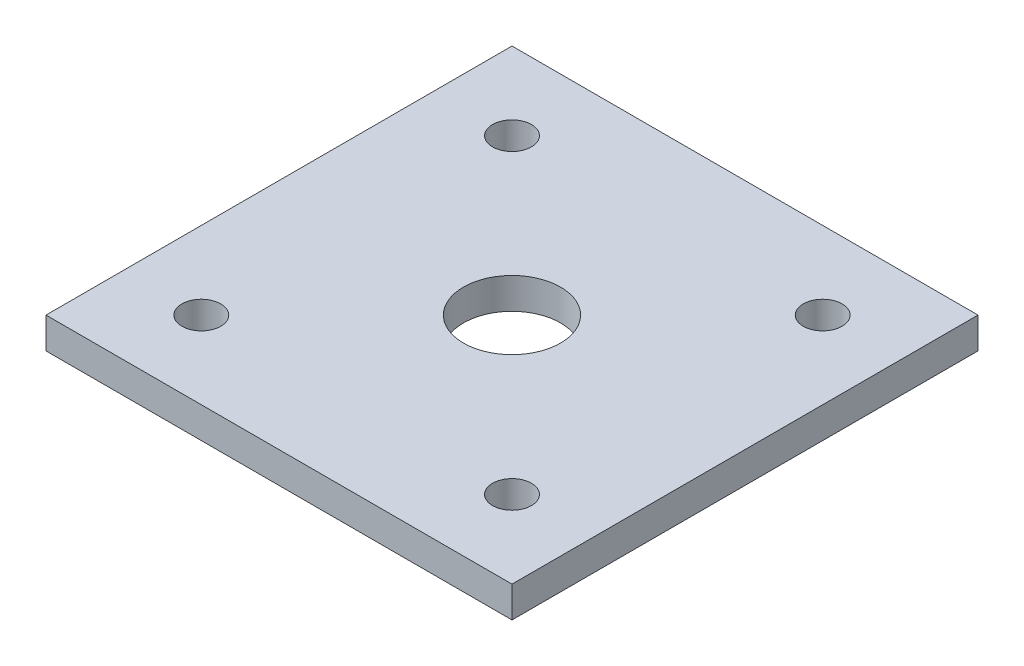
ISO-10303-21;
HEADER;
FILE_DESCRIPTION(('STEP AP214'),'2;1');
FILE_NAME('part.step','',(''),(''),'','','');
FILE_SCHEMA(('AUTOMOTIVE_DESIGN { 1 0 10303 214 1 1 1 1 }'));
ENDSEC;
DATA;
#1=APPLICATION_CONTEXT('core data for automotive mechanical design processes');
#2=APPLICATION_PROTOCOL_DEFINITION('international standard','automotive_design',2000,#1);
#3=PRODUCT_CONTEXT('',#1,'mechanical');
#4=PRODUCT('Part','Part','',(#3));
#5=PRODUCT_RELATED_PRODUCT_CATEGORY('part','',(#4));
#6=PRODUCT_DEFINITION_FORMATION('','',#4);
#7=PRODUCT_DEFINITION_CONTEXT('part definition',#1,'design');
#8=PRODUCT_DEFINITION('design','',#6,#7);
#9=PRODUCT_DEFINITION_SHAPE('','',#8);
#10=(LENGTH_UNIT() NAMED_UNIT(*) SI_UNIT(.MILLI.,.METRE.));
#11=(NAMED_UNIT(*) PLANE_ANGLE_UNIT() SI_UNIT($,.RADIAN.));
#12=(NAMED_UNIT(*) SI_UNIT($,.STERADIAN.) SOLID_ANGLE_UNIT());
#13=UNCERTAINTY_MEASURE_WITH_UNIT(LENGTH_MEASURE(1.E-05),#10,'distance_accuracy_value','');
#14=(GEOMETRIC_REPRESENTATION_CONTEXT(3) GLOBAL_UNCERTAINTY_ASSIGNED_CONTEXT((#13)) GLOBAL_UNIT_ASSIGNED_CONTEXT((#10,
#11,#12)) REPRESENTATION_CONTEXT('',''));
#15=CARTESIAN_POINT('',(0.,0.,0.));
#16=DIRECTION('',(0.,0.,1.));
#17=DIRECTION('',(1.,0.,0.));
#18=AXIS2_PLACEMENT_3D('',#15,#16,#17);
#19=CARTESIAN_POINT('',(60.,8.,-60.));
#20=DIRECTION('',(-1.,0.,0.));
#21=DIRECTION('',(0.,0.,1.));
#22=AXIS2_PLACEMENT_3D('',#19,#20,#21);
#23=PLANE('',#22);
#24=DIRECTION('',(0.,0.,-1.));
#25=VECTOR('',#24,1.);
#26=CARTESIAN_POINT('',(60.,0.,-60.));
#27=LINE('',#26,#25);
#28=CARTESIAN_POINT('',(60.,0.,60.));
#29=VERTEX_POINT('',#28);
#30=CARTESIAN_POINT('',(60.,0.,-60.));
#31=VERTEX_POINT('',#30);
#32=EDGE_CURVE('E95',#29,#31,#27,.T.);
#33=ORIENTED_EDGE('',*,*,#32,.T.);
#34=DIRECTION('',(0.,-1.,0.));
#35=VECTOR('',#34,1.);
#36=CARTESIAN_POINT('',(60.,8.,-60.));
#37=LINE('',#36,#35);
#38=CARTESIAN_POINT('',(60.,8.,-60.));
#39=VERTEX_POINT('',#38);
#40=EDGE_CURVE('E11',#39,#31,#37,.T.);
#41=ORIENTED_EDGE('',*,*,#40,.F.);
#42=DIRECTION('',(0.,0.,-1.));
#43=VECTOR('',#42,1.);
#44=CARTESIAN_POINT('',(60.,8.,-60.));
#45=LINE('',#44,#43);
#46=CARTESIAN_POINT('',(60.,8.,60.));
#47=VERTEX_POINT('',#46);
#48=EDGE_CURVE('E83',#47,#39,#45,.T.);
#49=ORIENTED_EDGE('',*,*,#48,.F.);
#50=DIRECTION('',(0.,-1.,0.));
#51=VECTOR('',#50,1.);
#52=CARTESIAN_POINT('',(60.,8.,60.));
#53=LINE('',#52,#51);
#54=EDGE_CURVE('E91',#47,#29,#53,.T.);
#55=ORIENTED_EDGE('',*,*,#54,.T.);
#56=EDGE_LOOP('',(#33,#41,#49,#55));
#57=FACE_BOUND('',#56,.T.);
#58=ADVANCED_FACE('F32',(#57),#23,.F.);
#59=CARTESIAN_POINT('',(-60.,8.,-60.));
#60=DIRECTION('',(0.,0.,1.));
#61=DIRECTION('',(1.,0.,0.));
#62=AXIS2_PLACEMENT_3D('',#59,#60,#61);
#63=PLANE('',#62);
#64=DIRECTION('',(-1.,0.,0.));
#65=VECTOR('',#64,1.);
#66=CARTESIAN_POINT('',(-60.,0.,-60.));
#67=LINE('',#66,#65);
#68=CARTESIAN_POINT('',(-60.,0.,-60.));
#69=VERTEX_POINT('',#68);
#70=EDGE_CURVE('E87',#31,#69,#67,.T.);
#71=ORIENTED_EDGE('',*,*,#70,.T.);
#72=DIRECTION('',(0.,-1.,0.));
#73=VECTOR('',#72,1.);
#74=CARTESIAN_POINT('',(-60.,8.,-60.));
#75=LINE('',#74,#73);
#76=CARTESIAN_POINT('',(-60.,8.,-60.));
#77=VERTEX_POINT('',#76);
#78=EDGE_CURVE('E40',#77,#69,#75,.T.);
#79=ORIENTED_EDGE('',*,*,#78,.F.);
#80=DIRECTION('',(-1.,0.,0.));
#81=VECTOR('',#80,1.);
#82=CARTESIAN_POINT('',(-60.,8.,-60.));
#83=LINE('',#82,#81);
#84=EDGE_CURVE('E78',#39,#77,#83,.T.);
#85=ORIENTED_EDGE('',*,*,#84,.F.);
#86=ORIENTED_EDGE('',*,*,#40,.T.);
#87=EDGE_LOOP('',(#71,#79,#85,#86));
#88=FACE_BOUND('',#87,.T.);
#89=ADVANCED_FACE('F86',(#88),#63,.F.);
#90=CARTESIAN_POINT('',(-60.,8.,-60.));
#91=DIRECTION('',(1.,0.,0.));
#92=DIRECTION('',(0.,0.,-1.));
#93=AXIS2_PLACEMENT_3D('',#90,#91,#92);
#94=PLANE('',#93);
#95=DIRECTION('',(0.,0.,1.));
#96=VECTOR('',#95,1.);
#97=CARTESIAN_POINT('',(-60.,0.,-60.));
#98=LINE('',#97,#96);
#99=CARTESIAN_POINT('',(-60.,0.,60.));
#100=VERTEX_POINT('',#99);
#101=EDGE_CURVE('E65',#69,#100,#98,.T.);
#102=ORIENTED_EDGE('',*,*,#101,.T.);
#103=DIRECTION('',(0.,-1.,0.));
#104=VECTOR('',#103,1.);
#105=CARTESIAN_POINT('',(-60.,8.,60.));
#106=LINE('',#105,#104);
#107=CARTESIAN_POINT('',(-60.,8.,60.));
#108=VERTEX_POINT('',#107);
#109=EDGE_CURVE('E88',#108,#100,#106,.T.);
#110=ORIENTED_EDGE('',*,*,#109,.F.);
#111=DIRECTION('',(0.,0.,1.));
#112=VECTOR('',#111,1.);
#113=CARTESIAN_POINT('',(-60.,8.,-60.));
#114=LINE('',#113,#112);
#115=EDGE_CURVE('E81',#77,#108,#114,.T.);
#116=ORIENTED_EDGE('',*,*,#115,.F.);
#117=ORIENTED_EDGE('',*,*,#78,.T.);
#118=EDGE_LOOP('',(#102,#110,#116,#117));
#119=FACE_BOUND('',#118,.T.);
#120=ADVANCED_FACE('F89',(#119),#94,.F.);
#121=CARTESIAN_POINT('',(-60.,8.,60.));
#122=DIRECTION('',(0.,0.,-1.));
#123=DIRECTION('',(-1.,0.,0.));
#124=AXIS2_PLACEMENT_3D('',#121,#122,#123);
#125=PLANE('',#124);
#126=DIRECTION('',(1.,0.,0.));
#127=VECTOR('',#126,1.);
#128=CARTESIAN_POINT('',(-60.,0.,60.));
#129=LINE('',#128,#127);
#130=EDGE_CURVE('E71',#100,#29,#129,.T.);
#131=ORIENTED_EDGE('',*,*,#130,.T.);
#132=ORIENTED_EDGE('',*,*,#54,.F.);
#133=DIRECTION('',(1.,0.,0.));
#134=VECTOR('',#133,1.);
#135=CARTESIAN_POINT('',(-60.,8.,60.));
#136=LINE('',#135,#134);
#137=EDGE_CURVE('E48',#108,#47,#136,.T.);
#138=ORIENTED_EDGE('',*,*,#137,.F.);
#139=ORIENTED_EDGE('',*,*,#109,.T.);
#140=EDGE_LOOP('',(#131,#132,#138,#139));
#141=FACE_BOUND('',#140,.T.);
#142=ADVANCED_FACE('F103',(#141),#125,.F.);
#143=CARTESIAN_POINT('',(0.,8.,0.));
#144=DIRECTION('',(0.,1.,0.));
#145=DIRECTION('',(0.,0.,1.));
#146=AXIS2_PLACEMENT_3D('',#143,#144,#145);
#147=PLANE('',#146);
#148=CARTESIAN_POINT('',(-40.,8.,40.));
#149=DIRECTION('',(0.,-1.,0.));
#150=DIRECTION('',(0.,0.,-1.));
#151=AXIS2_PLACEMENT_3D('',#148,#149,#150);
#152=CIRCLE('',#151,5.);
#153=CARTESIAN_POINT('',(-40.,8.,35.));
#154=VERTEX_POINT('',#153);
#155=EDGE_CURVE('E133',#154,#154,#152,.T.);
#156=ORIENTED_EDGE('',*,*,#155,.T.);
#157=EDGE_LOOP('',(#156));
#158=FACE_BOUND('',#157,.T.);
#159=CARTESIAN_POINT('',(40.,8.,40.));
#160=DIRECTION('',(0.,1.,0.));
#161=DIRECTION('',(0.,0.,-1.));
#162=AXIS2_PLACEMENT_3D('',#159,#160,#161);
#163=CIRCLE('',#162,5.);
#164=CARTESIAN_POINT('',(40.,8.,35.));
#165=VERTEX_POINT('',#164);
#166=EDGE_CURVE('E127',#165,#165,#163,.T.);
#167=ORIENTED_EDGE('',*,*,#166,.F.);
#168=EDGE_LOOP('',(#167));
#169=FACE_BOUND('',#168,.T.);
#170=CARTESIAN_POINT('',(40.,8.,-40.));
#171=DIRECTION('',(0.,-1.,0.));
#172=DIRECTION('',(0.,0.,1.));
#173=AXIS2_PLACEMENT_3D('',#170,#171,#172);
#174=CIRCLE('',#173,5.);
#175=CARTESIAN_POINT('',(40.,8.,-35.));
#176=VERTEX_POINT('',#175);
#177=EDGE_CURVE('E121',#176,#176,#174,.T.);
#178=ORIENTED_EDGE('',*,*,#177,.T.);
#179=EDGE_LOOP('',(#178));
#180=FACE_BOUND('',#179,.T.);
#181=CARTESIAN_POINT('',(-40.,8.,-40.));
#182=DIRECTION('',(0.,1.,0.));
#183=DIRECTION('',(0.,0.,1.));
#184=AXIS2_PLACEMENT_3D('',#181,#182,#183);
#185=CIRCLE('',#184,5.);
#186=CARTESIAN_POINT('',(-40.,8.,-35.));
#187=VERTEX_POINT('',#186);
#188=EDGE_CURVE('E115',#187,#187,#185,.T.);
#189=ORIENTED_EDGE('',*,*,#188,.F.);
#190=EDGE_LOOP('',(#189));
#191=FACE_BOUND('',#190,.T.);
#192=CARTESIAN_POINT('',(0.,8.,0.));
#193=DIRECTION('',(0.,1.,0.));
#194=DIRECTION('',(0.,0.,1.));
#195=AXIS2_PLACEMENT_3D('',#192,#193,#194);
#196=CIRCLE('',#195,12.5);
#197=CARTESIAN_POINT('',(0.,8.,12.5));
#198=VERTEX_POINT('',#197);
#199=EDGE_CURVE('E109',#198,#198,#196,.T.);
#200=ORIENTED_EDGE('',*,*,#199,.F.);
#201=EDGE_LOOP('',(#200));
#202=FACE_BOUND('',#201,.T.);
#203=ORIENTED_EDGE('',*,*,#48,.T.);
#204=ORIENTED_EDGE('',*,*,#84,.T.);
#205=ORIENTED_EDGE('',*,*,#115,.T.);
#206=ORIENTED_EDGE('',*,*,#137,.T.);
#207=EDGE_LOOP('',(#203,#204,#205,#206));
#208=FACE_BOUND('',#207,.T.);
#209=ADVANCED_FACE('F79',(#158,#169,#180,#191,#202,#208),#147,.T.);
#210=CARTESIAN_POINT('',(0.,0.,0.));
#211=DIRECTION('',(0.,1.,0.));
#212=DIRECTION('',(0.,0.,1.));
#213=AXIS2_PLACEMENT_3D('',#210,#211,#212);
#214=PLANE('',#213);
#215=CARTESIAN_POINT('',(-40.,0.,40.));
#216=DIRECTION('',(0.,-1.,0.));
#217=DIRECTION('',(0.,0.,-1.));
#218=AXIS2_PLACEMENT_3D('',#215,#216,#217);
#219=CIRCLE('',#218,5.);
#220=CARTESIAN_POINT('',(-40.,0.,35.));
#221=VERTEX_POINT('',#220);
#222=EDGE_CURVE('E130',#221,#221,#219,.T.);
#223=ORIENTED_EDGE('',*,*,#222,.F.);
#224=EDGE_LOOP('',(#223));
#225=FACE_BOUND('',#224,.T.);
#226=CARTESIAN_POINT('',(40.,0.,40.));
#227=DIRECTION('',(0.,1.,0.));
#228=DIRECTION('',(0.,0.,-1.));
#229=AXIS2_PLACEMENT_3D('',#226,#227,#228);
#230=CIRCLE('',#229,5.);
#231=CARTESIAN_POINT('',(40.,0.,35.));
#232=VERTEX_POINT('',#231);
#233=EDGE_CURVE('E124',#232,#232,#230,.T.);
#234=ORIENTED_EDGE('',*,*,#233,.T.);
#235=EDGE_LOOP('',(#234));
#236=FACE_BOUND('',#235,.T.);
#237=CARTESIAN_POINT('',(40.,0.,-40.));
#238=DIRECTION('',(0.,-1.,0.));
#239=DIRECTION('',(0.,0.,1.));
#240=AXIS2_PLACEMENT_3D('',#237,#238,#239);
#241=CIRCLE('',#240,5.);
#242=CARTESIAN_POINT('',(40.,0.,-35.));
#243=VERTEX_POINT('',#242);
#244=EDGE_CURVE('E118',#243,#243,#241,.T.);
#245=ORIENTED_EDGE('',*,*,#244,.F.);
#246=EDGE_LOOP('',(#245));
#247=FACE_BOUND('',#246,.T.);
#248=CARTESIAN_POINT('',(-40.,0.,-40.));
#249=DIRECTION('',(0.,1.,0.));
#250=DIRECTION('',(0.,0.,1.));
#251=AXIS2_PLACEMENT_3D('',#248,#249,#250);
#252=CIRCLE('',#251,5.);
#253=CARTESIAN_POINT('',(-40.,0.,-35.));
#254=VERTEX_POINT('',#253);
#255=EDGE_CURVE('E112',#254,#254,#252,.T.);
#256=ORIENTED_EDGE('',*,*,#255,.T.);
#257=EDGE_LOOP('',(#256));
#258=FACE_BOUND('',#257,.T.);
#259=CARTESIAN_POINT('',(0.,0.,0.));
#260=DIRECTION('',(0.,1.,0.));
#261=DIRECTION('',(0.,0.,1.));
#262=AXIS2_PLACEMENT_3D('',#259,#260,#261);
#263=CIRCLE('',#262,12.5);
#264=CARTESIAN_POINT('',(0.,0.,12.5));
#265=VERTEX_POINT('',#264);
#266=EDGE_CURVE('E98',#265,#265,#263,.T.);
#267=ORIENTED_EDGE('',*,*,#266,.T.);
#268=EDGE_LOOP('',(#267));
#269=FACE_BOUND('',#268,.T.);
#270=ORIENTED_EDGE('',*,*,#32,.F.);
#271=ORIENTED_EDGE('',*,*,#130,.F.);
#272=ORIENTED_EDGE('',*,*,#101,.F.);
#273=ORIENTED_EDGE('',*,*,#70,.F.);
#274=EDGE_LOOP('',(#270,#271,#272,#273));
#275=FACE_BOUND('',#274,.T.);
#276=ADVANCED_FACE('F106',(#225,#236,#247,#258,#269,#275),#214,.F.);
#277=CARTESIAN_POINT('',(0.,0.,0.));
#278=DIRECTION('',(0.,1.,0.));
#279=DIRECTION('',(0.,0.,1.));
#280=AXIS2_PLACEMENT_3D('',#277,#278,#279);
#281=CYLINDRICAL_SURFACE('',#280,12.5);
#282=ORIENTED_EDGE('',*,*,#266,.F.);
#283=EDGE_LOOP('',(#282));
#284=FACE_BOUND('',#283,.T.);
#285=ORIENTED_EDGE('',*,*,#199,.T.);
#286=EDGE_LOOP('',(#285));
#287=FACE_BOUND('',#286,.T.);
#288=ADVANCED_FACE('F144',(#284,#287),#281,.F.);
#289=CARTESIAN_POINT('',(-40.,0.,-40.));
#290=DIRECTION('',(0.,1.,0.));
#291=DIRECTION('',(0.,0.,1.));
#292=AXIS2_PLACEMENT_3D('',#289,#290,#291);
#293=CYLINDRICAL_SURFACE('',#292,5.);
#294=ORIENTED_EDGE('',*,*,#255,.F.);
#295=EDGE_LOOP('',(#294));
#296=FACE_BOUND('',#295,.T.);
#297=ORIENTED_EDGE('',*,*,#188,.T.);
#298=EDGE_LOOP('',(#297));
#299=FACE_BOUND('',#298,.T.);
#300=ADVANCED_FACE('F156',(#296,#299),#293,.F.);
#301=CARTESIAN_POINT('',(40.,0.,-40.));
#302=DIRECTION('',(0.,1.,0.));
#303=DIRECTION('',(0.,0.,1.));
#304=AXIS2_PLACEMENT_3D('',#301,#302,#303);
#305=CYLINDRICAL_SURFACE('',#304,5.);
#306=ORIENTED_EDGE('',*,*,#244,.T.);
#307=EDGE_LOOP('',(#306));
#308=FACE_BOUND('',#307,.T.);
#309=ORIENTED_EDGE('',*,*,#177,.F.);
#310=EDGE_LOOP('',(#309));
#311=FACE_BOUND('',#310,.T.);
#312=ADVANCED_FACE('F199',(#308,#311),#305,.F.);
#313=CARTESIAN_POINT('',(40.,0.,40.));
#314=DIRECTION('',(0.,1.,0.));
#315=DIRECTION('',(0.,0.,1.));
#316=AXIS2_PLACEMENT_3D('',#313,#314,#315);
#317=CYLINDRICAL_SURFACE('',#316,5.);
#318=ORIENTED_EDGE('',*,*,#233,.F.);
#319=EDGE_LOOP('',(#318));
#320=FACE_BOUND('',#319,.T.);
#321=ORIENTED_EDGE('',*,*,#166,.T.);
#322=EDGE_LOOP('',(#321));
#323=FACE_BOUND('',#322,.T.);
#324=ADVANCED_FACE('F208',(#320,#323),#317,.F.);
#325=CARTESIAN_POINT('',(-40.,0.,40.));
#326=DIRECTION('',(0.,1.,0.));
#327=DIRECTION('',(0.,0.,1.));
#328=AXIS2_PLACEMENT_3D('',#325,#326,#327);
#329=CYLINDRICAL_SURFACE('',#328,5.);
#330=ORIENTED_EDGE('',*,*,#222,.T.);
#331=EDGE_LOOP('',(#330));
#332=FACE_BOUND('',#331,.T.);
#333=ORIENTED_EDGE('',*,*,#155,.F.);
#334=EDGE_LOOP('',(#333));
#335=FACE_BOUND('',#334,.T.);
#336=ADVANCED_FACE('F139',(#332,#335),#329,.F.);
#337=CLOSED_SHELL('',(#58,#89,#120,#142,#209,#276,#288,#300,#312,#324,#336));
#338=MANIFOLD_SOLID_BREP('B2',#337);
#339=ADVANCED_BREP_SHAPE_REPRESENTATION('',(#18,#338),#14);
#340=SHAPE_DEFINITION_REPRESENTATION(#9,#339);
ENDSEC;
END-ISO-10303-21;
